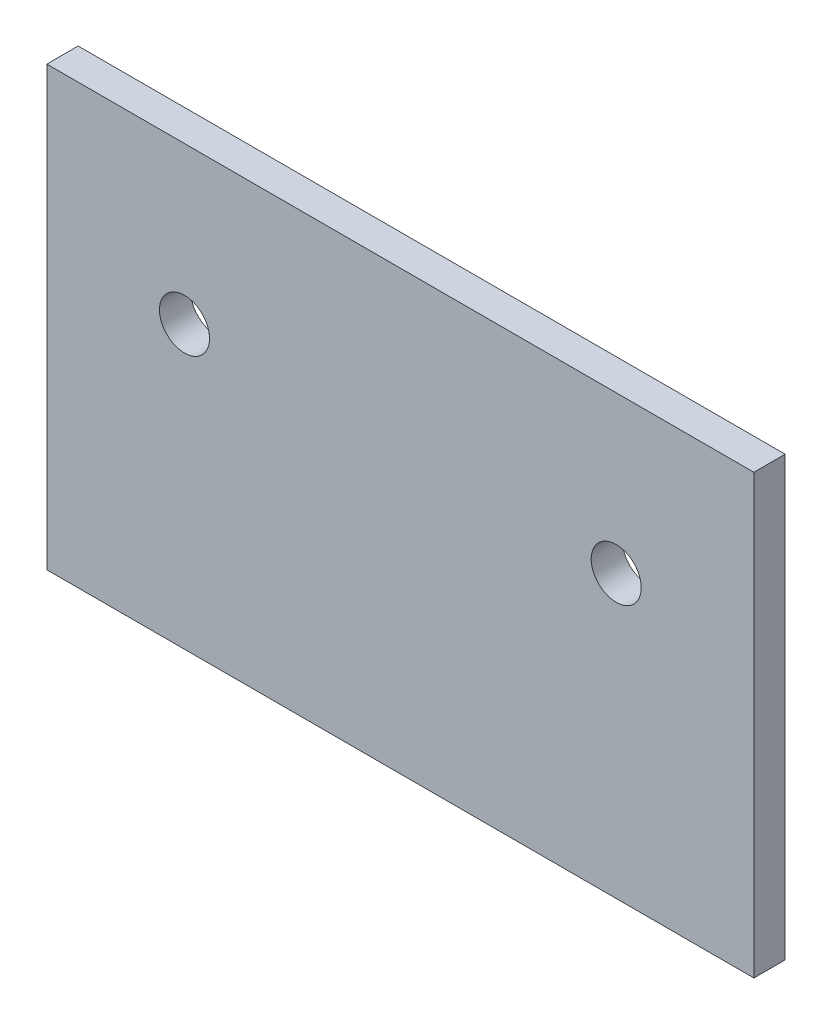
ISO-10303-21;
HEADER;
FILE_DESCRIPTION(('STEP AP214'),'2;1');
FILE_NAME('part.step','',(''),(''),'','','');
FILE_SCHEMA(('AUTOMOTIVE_DESIGN { 1 0 10303 214 1 1 1 1 }'));
ENDSEC;
DATA;
#1=APPLICATION_CONTEXT('core data for automotive mechanical design processes');
#2=APPLICATION_PROTOCOL_DEFINITION('international standard','automotive_design',2000,#1);
#3=PRODUCT_CONTEXT('',#1,'mechanical');
#4=PRODUCT('Part','Part','',(#3));
#5=PRODUCT_RELATED_PRODUCT_CATEGORY('part','',(#4));
#6=PRODUCT_DEFINITION_FORMATION('','',#4);
#7=PRODUCT_DEFINITION_CONTEXT('part definition',#1,'design');
#8=PRODUCT_DEFINITION('design','',#6,#7);
#9=PRODUCT_DEFINITION_SHAPE('','',#8);
#10=(LENGTH_UNIT() NAMED_UNIT(*) SI_UNIT(.MILLI.,.METRE.));
#11=(NAMED_UNIT(*) PLANE_ANGLE_UNIT() SI_UNIT($,.RADIAN.));
#12=(NAMED_UNIT(*) SI_UNIT($,.STERADIAN.) SOLID_ANGLE_UNIT());
#13=UNCERTAINTY_MEASURE_WITH_UNIT(LENGTH_MEASURE(1.E-05),#10,'distance_accuracy_value','');
#14=(GEOMETRIC_REPRESENTATION_CONTEXT(3) GLOBAL_UNCERTAINTY_ASSIGNED_CONTEXT((#13)) GLOBAL_UNIT_ASSIGNED_CONTEXT((#10,
#11,#12)) REPRESENTATION_CONTEXT('',''));
#15=CARTESIAN_POINT('',(0.,0.,0.));
#16=DIRECTION('',(0.,0.,1.));
#17=DIRECTION('',(1.,0.,0.));
#18=AXIS2_PLACEMENT_3D('',#15,#16,#17);
#19=CARTESIAN_POINT('',(0.,0.,5.));
#20=DIRECTION('',(0.,0.,1.));
#21=DIRECTION('',(1.,0.,0.));
#22=AXIS2_PLACEMENT_3D('',#19,#20,#21);
#23=PLANE('',#22);
#24=CARTESIAN_POINT('',(-34.5,10.,5.));
#25=DIRECTION('',(0.,0.,1.));
#26=DIRECTION('',(1.,0.,0.));
#27=AXIS2_PLACEMENT_3D('',#24,#25,#26);
#28=CIRCLE('',#27,4.);
#29=CARTESIAN_POINT('',(-30.5,10.,5.));
#30=VERTEX_POINT('',#29);
#31=EDGE_CURVE('E102',#30,#30,#28,.T.);
#32=ORIENTED_EDGE('',*,*,#31,.F.);
#33=EDGE_LOOP('',(#32));
#34=FACE_BOUND('',#33,.T.);
#35=DIRECTION('',(0.,-1.,0.));
#36=VECTOR('',#35,1.);
#37=CARTESIAN_POINT('',(-56.5,-35.,5.));
#38=LINE('',#37,#36);
#39=CARTESIAN_POINT('',(-56.5,35.,5.));
#40=VERTEX_POINT('',#39);
#41=CARTESIAN_POINT('',(-56.5,-35.,5.));
#42=VERTEX_POINT('',#41);
#43=EDGE_CURVE('E87',#40,#42,#38,.T.);
#44=ORIENTED_EDGE('',*,*,#43,.T.);
#45=DIRECTION('',(1.,0.,0.));
#46=VECTOR('',#45,1.);
#47=CARTESIAN_POINT('',(56.5,-35.,5.));
#48=LINE('',#47,#46);
#49=CARTESIAN_POINT('',(56.5,-35.,5.));
#50=VERTEX_POINT('',#49);
#51=EDGE_CURVE('E82',#42,#50,#48,.T.);
#52=ORIENTED_EDGE('',*,*,#51,.T.);
#53=DIRECTION('',(0.,1.,0.));
#54=VECTOR('',#53,1.);
#55=CARTESIAN_POINT('',(56.5,-35.,5.));
#56=LINE('',#55,#54);
#57=CARTESIAN_POINT('',(56.5,35.,5.));
#58=VERTEX_POINT('',#57);
#59=EDGE_CURVE('E85',#50,#58,#56,.T.);
#60=ORIENTED_EDGE('',*,*,#59,.T.);
#61=DIRECTION('',(-1.,0.,0.));
#62=VECTOR('',#61,1.);
#63=CARTESIAN_POINT('',(56.5,35.,5.));
#64=LINE('',#63,#62);
#65=EDGE_CURVE('E52',#58,#40,#64,.T.);
#66=ORIENTED_EDGE('',*,*,#65,.T.);
#67=EDGE_LOOP('',(#44,#52,#60,#66));
#68=FACE_BOUND('',#67,.T.);
#69=CARTESIAN_POINT('',(34.5,10.,5.));
#70=DIRECTION('',(0.,0.,1.));
#71=DIRECTION('',(1.,0.,0.));
#72=AXIS2_PLACEMENT_3D('',#69,#70,#71);
#73=CIRCLE('',#72,4.00000000000001);
#74=CARTESIAN_POINT('',(38.5,10.,5.));
#75=VERTEX_POINT('',#74);
#76=EDGE_CURVE('E117',#75,#75,#73,.T.);
#77=ORIENTED_EDGE('',*,*,#76,.F.);
#78=EDGE_LOOP('',(#77));
#79=FACE_BOUND('',#78,.T.);
#80=ADVANCED_FACE('F35',(#34,#68,#79),#23,.T.);
#81=CARTESIAN_POINT('',(0.,0.,0.));
#82=DIRECTION('',(0.,0.,1.));
#83=DIRECTION('',(1.,0.,0.));
#84=AXIS2_PLACEMENT_3D('',#81,#82,#83);
#85=PLANE('',#84);
#86=CARTESIAN_POINT('',(-34.5,10.,0.));
#87=DIRECTION('',(0.,0.,1.));
#88=DIRECTION('',(1.,0.,0.));
#89=AXIS2_PLACEMENT_3D('',#86,#87,#88);
#90=CIRCLE('',#89,4.);
#91=CARTESIAN_POINT('',(-30.5,10.,0.));
#92=VERTEX_POINT('',#91);
#93=EDGE_CURVE('E114',#92,#92,#90,.T.);
#94=ORIENTED_EDGE('',*,*,#93,.T.);
#95=EDGE_LOOP('',(#94));
#96=FACE_BOUND('',#95,.T.);
#97=DIRECTION('',(0.,-1.,0.));
#98=VECTOR('',#97,1.);
#99=CARTESIAN_POINT('',(-56.5,-35.,0.));
#100=LINE('',#99,#98);
#101=CARTESIAN_POINT('',(-56.5,35.,0.));
#102=VERTEX_POINT('',#101);
#103=CARTESIAN_POINT('',(-56.5,-35.,0.));
#104=VERTEX_POINT('',#103);
#105=EDGE_CURVE('E99',#102,#104,#100,.T.);
#106=ORIENTED_EDGE('',*,*,#105,.F.);
#107=DIRECTION('',(-1.,0.,0.));
#108=VECTOR('',#107,1.);
#109=CARTESIAN_POINT('',(56.5,35.,0.));
#110=LINE('',#109,#108);
#111=CARTESIAN_POINT('',(56.5,35.,0.));
#112=VERTEX_POINT('',#111);
#113=EDGE_CURVE('E75',#112,#102,#110,.T.);
#114=ORIENTED_EDGE('',*,*,#113,.F.);
#115=DIRECTION('',(0.,1.,0.));
#116=VECTOR('',#115,1.);
#117=CARTESIAN_POINT('',(56.5,-35.,0.));
#118=LINE('',#117,#116);
#119=CARTESIAN_POINT('',(56.5,-35.,0.));
#120=VERTEX_POINT('',#119);
#121=EDGE_CURVE('E69',#120,#112,#118,.T.);
#122=ORIENTED_EDGE('',*,*,#121,.F.);
#123=DIRECTION('',(1.,0.,0.));
#124=VECTOR('',#123,1.);
#125=CARTESIAN_POINT('',(56.5,-35.,0.));
#126=LINE('',#125,#124);
#127=EDGE_CURVE('E91',#104,#120,#126,.T.);
#128=ORIENTED_EDGE('',*,*,#127,.F.);
#129=EDGE_LOOP('',(#106,#114,#122,#128));
#130=FACE_BOUND('',#129,.T.);
#131=CARTESIAN_POINT('',(34.5,10.,0.));
#132=DIRECTION('',(0.,0.,1.));
#133=DIRECTION('',(1.,0.,0.));
#134=AXIS2_PLACEMENT_3D('',#131,#132,#133);
#135=CIRCLE('',#134,4.00000000000001);
#136=CARTESIAN_POINT('',(38.5,10.,0.));
#137=VERTEX_POINT('',#136);
#138=EDGE_CURVE('E120',#137,#137,#135,.T.);
#139=ORIENTED_EDGE('',*,*,#138,.T.);
#140=EDGE_LOOP('',(#139));
#141=FACE_BOUND('',#140,.T.);
#142=ADVANCED_FACE('F110',(#96,#130,#141),#85,.F.);
#143=CARTESIAN_POINT('',(-56.5,-35.,5.));
#144=DIRECTION('',(1.,0.,0.));
#145=DIRECTION('',(0.,0.,-1.));
#146=AXIS2_PLACEMENT_3D('',#143,#144,#145);
#147=PLANE('',#146);
#148=ORIENTED_EDGE('',*,*,#105,.T.);
#149=DIRECTION('',(0.,0.,-1.));
#150=VECTOR('',#149,1.);
#151=CARTESIAN_POINT('',(-56.5,-35.,5.));
#152=LINE('',#151,#150);
#153=EDGE_CURVE('E11',#42,#104,#152,.T.);
#154=ORIENTED_EDGE('',*,*,#153,.F.);
#155=ORIENTED_EDGE('',*,*,#43,.F.);
#156=DIRECTION('',(0.,0.,-1.));
#157=VECTOR('',#156,1.);
#158=CARTESIAN_POINT('',(-56.5,35.,5.));
#159=LINE('',#158,#157);
#160=EDGE_CURVE('E95',#40,#102,#159,.T.);
#161=ORIENTED_EDGE('',*,*,#160,.T.);
#162=EDGE_LOOP('',(#148,#154,#155,#161));
#163=FACE_BOUND('',#162,.T.);
#164=ADVANCED_FACE('F37',(#163),#147,.F.);
#165=CARTESIAN_POINT('',(56.5,-35.,5.));
#166=DIRECTION('',(0.,1.,0.));
#167=DIRECTION('',(-1.,0.,0.));
#168=AXIS2_PLACEMENT_3D('',#165,#166,#167);
#169=PLANE('',#168);
#170=ORIENTED_EDGE('',*,*,#127,.T.);
#171=DIRECTION('',(0.,0.,-1.));
#172=VECTOR('',#171,1.);
#173=CARTESIAN_POINT('',(56.5,-35.,5.));
#174=LINE('',#173,#172);
#175=EDGE_CURVE('E44',#50,#120,#174,.T.);
#176=ORIENTED_EDGE('',*,*,#175,.F.);
#177=ORIENTED_EDGE('',*,*,#51,.F.);
#178=ORIENTED_EDGE('',*,*,#153,.T.);
#179=EDGE_LOOP('',(#170,#176,#177,#178));
#180=FACE_BOUND('',#179,.T.);
#181=ADVANCED_FACE('F90',(#180),#169,.F.);
#182=CARTESIAN_POINT('',(56.5,-35.,5.));
#183=DIRECTION('',(-1.,0.,0.));
#184=DIRECTION('',(0.,0.,1.));
#185=AXIS2_PLACEMENT_3D('',#182,#183,#184);
#186=PLANE('',#185);
#187=ORIENTED_EDGE('',*,*,#121,.T.);
#188=DIRECTION('',(0.,0.,-1.));
#189=VECTOR('',#188,1.);
#190=CARTESIAN_POINT('',(56.5,35.,5.));
#191=LINE('',#190,#189);
#192=EDGE_CURVE('E92',#58,#112,#191,.T.);
#193=ORIENTED_EDGE('',*,*,#192,.F.);
#194=ORIENTED_EDGE('',*,*,#59,.F.);
#195=ORIENTED_EDGE('',*,*,#175,.T.);
#196=EDGE_LOOP('',(#187,#193,#194,#195));
#197=FACE_BOUND('',#196,.T.);
#198=ADVANCED_FACE('F93',(#197),#186,.F.);
#199=CARTESIAN_POINT('',(56.5,35.,5.));
#200=DIRECTION('',(0.,-1.,0.));
#201=DIRECTION('',(1.,0.,0.));
#202=AXIS2_PLACEMENT_3D('',#199,#200,#201);
#203=PLANE('',#202);
#204=ORIENTED_EDGE('',*,*,#113,.T.);
#205=ORIENTED_EDGE('',*,*,#160,.F.);
#206=ORIENTED_EDGE('',*,*,#65,.F.);
#207=ORIENTED_EDGE('',*,*,#192,.T.);
#208=EDGE_LOOP('',(#204,#205,#206,#207));
#209=FACE_BOUND('',#208,.T.);
#210=ADVANCED_FACE('F107',(#209),#203,.F.);
#211=CARTESIAN_POINT('',(-34.5,10.,5.));
#212=DIRECTION('',(0.,0.,-1.));
#213=DIRECTION('',(-1.,0.,0.));
#214=AXIS2_PLACEMENT_3D('',#211,#212,#213);
#215=CYLINDRICAL_SURFACE('',#214,4.);
#216=ORIENTED_EDGE('',*,*,#31,.T.);
#217=EDGE_LOOP('',(#216));
#218=FACE_BOUND('',#217,.T.);
#219=ORIENTED_EDGE('',*,*,#93,.F.);
#220=EDGE_LOOP('',(#219));
#221=FACE_BOUND('',#220,.T.);
#222=ADVANCED_FACE('F138',(#218,#221),#215,.F.);
#223=CARTESIAN_POINT('',(34.5,10.,5.));
#224=DIRECTION('',(0.,0.,-1.));
#225=DIRECTION('',(-1.,0.,0.));
#226=AXIS2_PLACEMENT_3D('',#223,#224,#225);
#227=CYLINDRICAL_SURFACE('',#226,4.00000000000001);
#228=ORIENTED_EDGE('',*,*,#76,.T.);
#229=EDGE_LOOP('',(#228));
#230=FACE_BOUND('',#229,.T.);
#231=ORIENTED_EDGE('',*,*,#138,.F.);
#232=EDGE_LOOP('',(#231));
#233=FACE_BOUND('',#232,.T.);
#234=ADVANCED_FACE('F126',(#230,#233),#227,.F.);
#235=CLOSED_SHELL('',(#80,#142,#164,#181,#198,#210,#222,#234));
#236=MANIFOLD_SOLID_BREP('B2',#235);
#237=ADVANCED_BREP_SHAPE_REPRESENTATION('',(#18,#236),#14);
#238=SHAPE_DEFINITION_REPRESENTATION(#9,#237);
ENDSEC;
END-ISO-10303-21;
